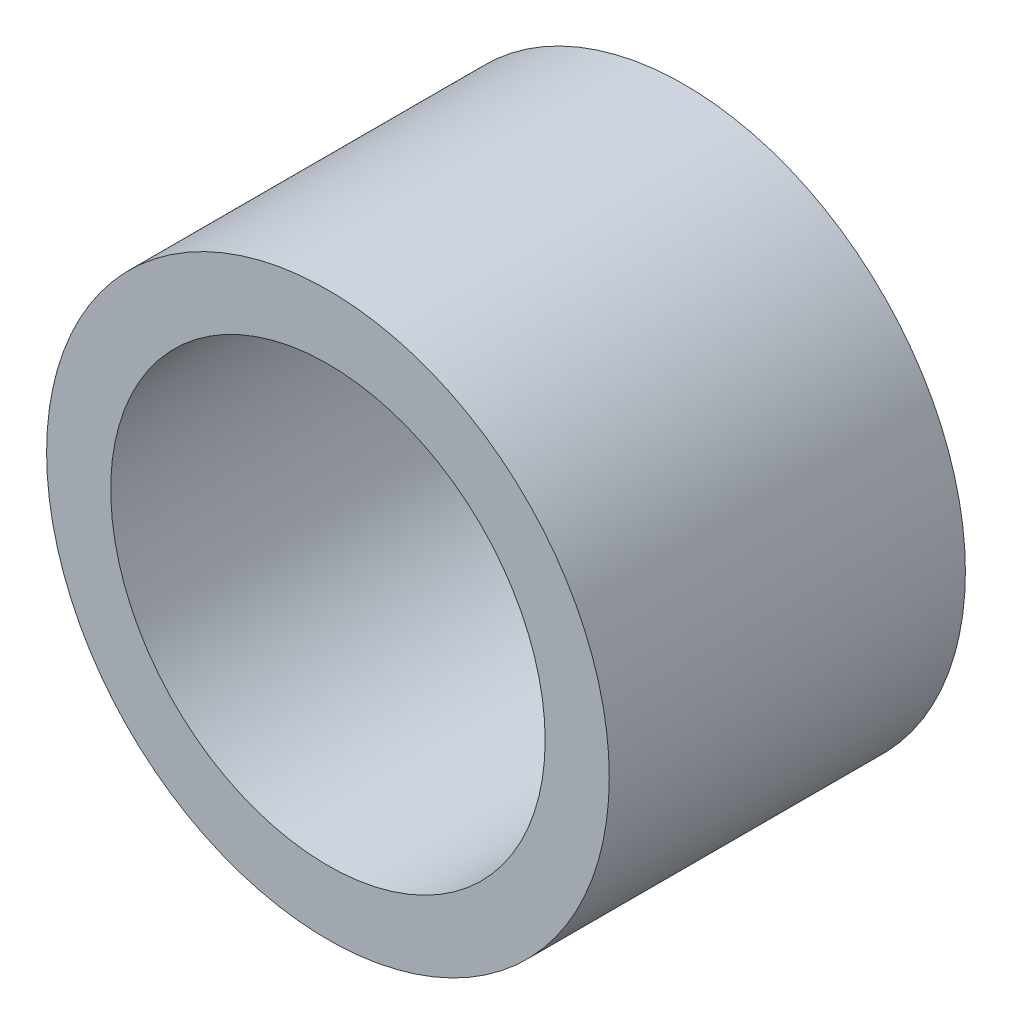
ISO-10303-21;
HEADER;
FILE_DESCRIPTION(('STEP AP214'),'2;1');
FILE_NAME('part.step','',(''),(''),'','','');
FILE_SCHEMA(('AUTOMOTIVE_DESIGN { 1 0 10303 214 1 1 1 1 }'));
ENDSEC;
DATA;
#1=APPLICATION_CONTEXT('core data for automotive mechanical design processes');
#2=APPLICATION_PROTOCOL_DEFINITION('international standard','automotive_design',2000,#1);
#3=PRODUCT_CONTEXT('',#1,'mechanical');
#4=PRODUCT('Part','Part','',(#3));
#5=PRODUCT_RELATED_PRODUCT_CATEGORY('part','',(#4));
#6=PRODUCT_DEFINITION_FORMATION('','',#4);
#7=PRODUCT_DEFINITION_CONTEXT('part definition',#1,'design');
#8=PRODUCT_DEFINITION('design','',#6,#7);
#9=PRODUCT_DEFINITION_SHAPE('','',#8);
#10=(LENGTH_UNIT() NAMED_UNIT(*) SI_UNIT(.MILLI.,.METRE.));
#11=(NAMED_UNIT(*) PLANE_ANGLE_UNIT() SI_UNIT($,.RADIAN.));
#12=(NAMED_UNIT(*) SI_UNIT($,.STERADIAN.) SOLID_ANGLE_UNIT());
#13=UNCERTAINTY_MEASURE_WITH_UNIT(LENGTH_MEASURE(1.E-05),#10,'distance_accuracy_value','');
#14=(GEOMETRIC_REPRESENTATION_CONTEXT(3) GLOBAL_UNCERTAINTY_ASSIGNED_CONTEXT((#13)) GLOBAL_UNIT_ASSIGNED_CONTEXT((#10,
#11,#12)) REPRESENTATION_CONTEXT('',''));
#15=CARTESIAN_POINT('',(0.,0.,0.));
#16=DIRECTION('',(0.,0.,1.));
#17=DIRECTION('',(1.,0.,0.));
#18=AXIS2_PLACEMENT_3D('',#15,#16,#17);
#19=CARTESIAN_POINT('',(0.,0.,-2.5));
#20=DIRECTION('',(0.,0.,1.));
#21=DIRECTION('',(1.,0.,0.));
#22=AXIS2_PLACEMENT_3D('',#19,#20,#21);
#23=CYLINDRICAL_SURFACE('',#22,3.95);
#24=CARTESIAN_POINT('',(0.,0.,-2.5));
#25=DIRECTION('',(0.,0.,1.));
#26=DIRECTION('',(1.,0.,0.));
#27=AXIS2_PLACEMENT_3D('',#24,#25,#26);
#28=CIRCLE('',#27,3.95);
#29=CARTESIAN_POINT('',(3.95,0.,-2.5));
#30=VERTEX_POINT('',#29);
#31=EDGE_CURVE('E10',#30,#30,#28,.T.);
#32=ORIENTED_EDGE('',*,*,#31,.T.);
#33=EDGE_LOOP('',(#32));
#34=FACE_BOUND('',#33,.T.);
#35=CARTESIAN_POINT('',(0.,0.,2.5));
#36=DIRECTION('',(0.,0.,1.));
#37=DIRECTION('',(1.,0.,0.));
#38=AXIS2_PLACEMENT_3D('',#35,#36,#37);
#39=CIRCLE('',#38,3.95);
#40=CARTESIAN_POINT('',(3.95,0.,2.5));
#41=VERTEX_POINT('',#40);
#42=EDGE_CURVE('E49',#41,#41,#39,.T.);
#43=ORIENTED_EDGE('',*,*,#42,.F.);
#44=EDGE_LOOP('',(#43));
#45=FACE_BOUND('',#44,.T.);
#46=ADVANCED_FACE('F37',(#34,#45),#23,.T.);
#47=CARTESIAN_POINT('',(0.,0.,-2.5));
#48=DIRECTION('',(0.,0.,1.));
#49=DIRECTION('',(1.,0.,0.));
#50=AXIS2_PLACEMENT_3D('',#47,#48,#49);
#51=PLANE('',#50);
#52=CARTESIAN_POINT('',(0.,0.,-2.5));
#53=DIRECTION('',(0.,0.,1.));
#54=DIRECTION('',(1.,0.,0.));
#55=AXIS2_PLACEMENT_3D('',#52,#53,#54);
#56=CIRCLE('',#55,3.05);
#57=CARTESIAN_POINT('',(3.05,0.,-2.5));
#58=VERTEX_POINT('',#57);
#59=EDGE_CURVE('E44',#58,#58,#56,.T.);
#60=ORIENTED_EDGE('',*,*,#59,.T.);
#61=EDGE_LOOP('',(#60));
#62=FACE_BOUND('',#61,.T.);
#63=ORIENTED_EDGE('',*,*,#31,.F.);
#64=EDGE_LOOP('',(#63));
#65=FACE_BOUND('',#64,.T.);
#66=ADVANCED_FACE('F70',(#62,#65),#51,.F.);
#67=CARTESIAN_POINT('',(0.,0.,-2.5));
#68=DIRECTION('',(0.,0.,1.));
#69=DIRECTION('',(1.,0.,0.));
#70=AXIS2_PLACEMENT_3D('',#67,#68,#69);
#71=CYLINDRICAL_SURFACE('',#70,3.05);
#72=ORIENTED_EDGE('',*,*,#59,.F.);
#73=EDGE_LOOP('',(#72));
#74=FACE_BOUND('',#73,.T.);
#75=CARTESIAN_POINT('',(0.,0.,2.5));
#76=DIRECTION('',(0.,0.,1.));
#77=DIRECTION('',(1.,0.,0.));
#78=AXIS2_PLACEMENT_3D('',#75,#76,#77);
#79=CIRCLE('',#78,3.05);
#80=CARTESIAN_POINT('',(3.05,0.,2.5));
#81=VERTEX_POINT('',#80);
#82=EDGE_CURVE('E54',#81,#81,#79,.T.);
#83=ORIENTED_EDGE('',*,*,#82,.T.);
#84=EDGE_LOOP('',(#83));
#85=FACE_BOUND('',#84,.T.);
#86=ADVANCED_FACE('F61',(#74,#85),#71,.F.);
#87=CARTESIAN_POINT('',(0.,0.,2.5));
#88=DIRECTION('',(0.,0.,1.));
#89=DIRECTION('',(1.,0.,0.));
#90=AXIS2_PLACEMENT_3D('',#87,#88,#89);
#91=PLANE('',#90);
#92=ORIENTED_EDGE('',*,*,#42,.T.);
#93=EDGE_LOOP('',(#92));
#94=FACE_BOUND('',#93,.T.);
#95=ORIENTED_EDGE('',*,*,#82,.F.);
#96=EDGE_LOOP('',(#95));
#97=FACE_BOUND('',#96,.T.);
#98=ADVANCED_FACE('F63',(#94,#97),#91,.T.);
#99=CLOSED_SHELL('',(#46,#66,#86,#98));
#100=MANIFOLD_SOLID_BREP('B2',#99);
#101=ADVANCED_BREP_SHAPE_REPRESENTATION('',(#18,#100),#14);
#102=SHAPE_DEFINITION_REPRESENTATION(#9,#101);
ENDSEC;
END-ISO-10303-21;
